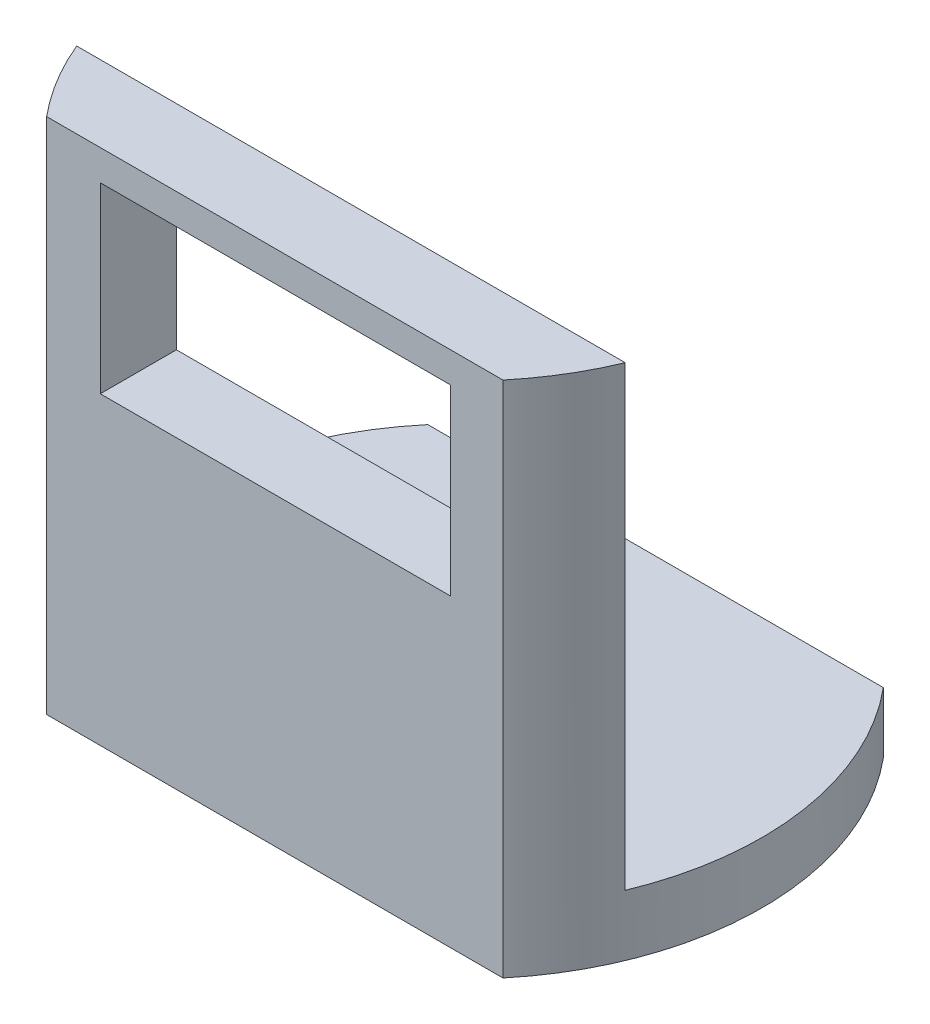
ISO-10303-21;
HEADER;
FILE_DESCRIPTION(('STEP AP214'),'2;1');
FILE_NAME('part.step','',(''),(''),'','','');
FILE_SCHEMA(('AUTOMOTIVE_DESIGN { 1 0 10303 214 1 1 1 1 }'));
ENDSEC;
DATA;
#1=APPLICATION_CONTEXT('core data for automotive mechanical design processes');
#2=APPLICATION_PROTOCOL_DEFINITION('international standard','automotive_design',2000,#1);
#3=PRODUCT_CONTEXT('',#1,'mechanical');
#4=PRODUCT('Part','Part','',(#3));
#5=PRODUCT_RELATED_PRODUCT_CATEGORY('part','',(#4));
#6=PRODUCT_DEFINITION_FORMATION('','',#4);
#7=PRODUCT_DEFINITION_CONTEXT('part definition',#1,'design');
#8=PRODUCT_DEFINITION('design','',#6,#7);
#9=PRODUCT_DEFINITION_SHAPE('','',#8);
#10=(LENGTH_UNIT() NAMED_UNIT(*) SI_UNIT(.MILLI.,.METRE.));
#11=(NAMED_UNIT(*) PLANE_ANGLE_UNIT() SI_UNIT($,.RADIAN.));
#12=(NAMED_UNIT(*) SI_UNIT($,.STERADIAN.) SOLID_ANGLE_UNIT());
#13=UNCERTAINTY_MEASURE_WITH_UNIT(LENGTH_MEASURE(1.E-05),#10,'distance_accuracy_value','');
#14=(GEOMETRIC_REPRESENTATION_CONTEXT(3) GLOBAL_UNCERTAINTY_ASSIGNED_CONTEXT((#13)) GLOBAL_UNIT_ASSIGNED_CONTEXT((#10,
#11,#12)) REPRESENTATION_CONTEXT('',''));
#15=CARTESIAN_POINT('',(0.,0.,0.));
#16=DIRECTION('',(0.,0.,1.));
#17=DIRECTION('',(1.,0.,0.));
#18=AXIS2_PLACEMENT_3D('',#15,#16,#17);
#19=CARTESIAN_POINT('',(-20.,15.,5.));
#20=DIRECTION('',(0.,-1.,0.));
#21=DIRECTION('',(0.,0.,-1.));
#22=AXIS2_PLACEMENT_3D('',#19,#20,#21);
#23=PLANE('',#22);
#24=CARTESIAN_POINT('',(-0.0431315727550396,15.,-7.4856978274626));
#25=DIRECTION('',(0.,-1.,0.));
#26=DIRECTION('',(0.,0.,-1.));
#27=AXIS2_PLACEMENT_3D('',#24,#25,#26);
#28=CIRCLE('',#27,19.5);
#29=CARTESIAN_POINT('',(-18.0490841450552,15.,0.));
#30=VERTEX_POINT('',#29);
#31=CARTESIAN_POINT('',(-15.0216945799762,15.,5.));
#32=VERTEX_POINT('',#31);
#33=EDGE_CURVE('E175',#30,#32,#28,.F.);
#34=ORIENTED_EDGE('',*,*,#33,.T.);
#35=DIRECTION('',(-1.,0.,0.));
#36=VECTOR('',#35,1.);
#37=CARTESIAN_POINT('',(-20.,15.,5.));
#38=LINE('',#37,#36);
#39=CARTESIAN_POINT('',(14.9354314344662,15.,5.));
#40=VERTEX_POINT('',#39);
#41=EDGE_CURVE('E11',#40,#32,#38,.T.);
#42=ORIENTED_EDGE('',*,*,#41,.F.);
#43=CARTESIAN_POINT('',(17.9628209995451,15.,0.));
#44=VERTEX_POINT('',#43);
#45=EDGE_CURVE('E170',#40,#44,#28,.F.);
#46=ORIENTED_EDGE('',*,*,#45,.T.);
#47=DIRECTION('',(-1.,0.,0.));
#48=VECTOR('',#47,1.);
#49=CARTESIAN_POINT('',(-20.,15.,0.));
#50=LINE('',#49,#48);
#51=EDGE_CURVE('E142',#44,#30,#50,.T.);
#52=ORIENTED_EDGE('',*,*,#51,.T.);
#53=EDGE_LOOP('',(#34,#42,#46,#52));
#54=FACE_BOUND('',#53,.T.);
#55=ADVANCED_FACE('F39',(#54),#23,.F.);
#56=CARTESIAN_POINT('',(0.,0.,5.));
#57=DIRECTION('',(0.,0.,1.));
#58=DIRECTION('',(1.,0.,0.));
#59=AXIS2_PLACEMENT_3D('',#56,#57,#58);
#60=PLANE('',#59);
#61=DIRECTION('',(0.,1.,0.));
#62=VECTOR('',#61,1.);
#63=CARTESIAN_POINT('',(-11.5,13.,5.));
#64=LINE('',#63,#62);
#65=CARTESIAN_POINT('',(-11.5,1.,5.));
#66=VERTEX_POINT('',#65);
#67=CARTESIAN_POINT('',(-11.5,13.,5.));
#68=VERTEX_POINT('',#67);
#69=EDGE_CURVE('E189',#66,#68,#64,.T.);
#70=ORIENTED_EDGE('',*,*,#69,.T.);
#71=DIRECTION('',(1.,0.,0.));
#72=VECTOR('',#71,1.);
#73=CARTESIAN_POINT('',(11.5,13.,5.));
#74=LINE('',#73,#72);
#75=CARTESIAN_POINT('',(11.5,13.,5.));
#76=VERTEX_POINT('',#75);
#77=EDGE_CURVE('E193',#68,#76,#74,.T.);
#78=ORIENTED_EDGE('',*,*,#77,.T.);
#79=DIRECTION('',(0.,-1.,0.));
#80=VECTOR('',#79,1.);
#81=CARTESIAN_POINT('',(11.5,13.,5.));
#82=LINE('',#81,#80);
#83=CARTESIAN_POINT('',(11.5,1.,5.));
#84=VERTEX_POINT('',#83);
#85=EDGE_CURVE('E198',#76,#84,#82,.T.);
#86=ORIENTED_EDGE('',*,*,#85,.T.);
#87=DIRECTION('',(-1.,0.,0.));
#88=VECTOR('',#87,1.);
#89=CARTESIAN_POINT('',(11.5,1.,5.));
#90=LINE('',#89,#88);
#91=EDGE_CURVE('E202',#84,#66,#90,.T.);
#92=ORIENTED_EDGE('',*,*,#91,.T.);
#93=EDGE_LOOP('',(#70,#78,#86,#92));
#94=FACE_BOUND('',#93,.T.);
#95=ORIENTED_EDGE('',*,*,#41,.T.);
#96=DIRECTION('',(0.,-1.,0.));
#97=VECTOR('',#96,1.);
#98=CARTESIAN_POINT('',(-15.0216945799762,15.001,5.));
#99=LINE('',#98,#97);
#100=CARTESIAN_POINT('',(-15.0216945799762,-19.,5.));
#101=VERTEX_POINT('',#100);
#102=EDGE_CURVE('E266',#101,#32,#99,.F.);
#103=ORIENTED_EDGE('',*,*,#102,.F.);
#104=DIRECTION('',(-1.,0.,0.));
#105=VECTOR('',#104,1.);
#106=CARTESIAN_POINT('',(-20.,-19.,5.));
#107=LINE('',#106,#105);
#108=CARTESIAN_POINT('',(14.9354314344662,-19.,5.));
#109=VERTEX_POINT('',#108);
#110=EDGE_CURVE('E138',#109,#101,#107,.T.);
#111=ORIENTED_EDGE('',*,*,#110,.F.);
#112=DIRECTION('',(0.,-1.,0.));
#113=VECTOR('',#112,1.);
#114=CARTESIAN_POINT('',(14.9354314344662,15.001,5.));
#115=LINE('',#114,#113);
#116=EDGE_CURVE('E55',#40,#109,#115,.T.);
#117=ORIENTED_EDGE('',*,*,#116,.F.);
#118=EDGE_LOOP('',(#95,#103,#111,#117));
#119=FACE_BOUND('',#118,.T.);
#120=ADVANCED_FACE('F243',(#94,#119),#60,.T.);
#121=CARTESIAN_POINT('',(0.,0.,0.));
#122=DIRECTION('',(0.,0.,1.));
#123=DIRECTION('',(1.,0.,0.));
#124=AXIS2_PLACEMENT_3D('',#121,#122,#123);
#125=PLANE('',#124);
#126=DIRECTION('',(0.,-1.,0.));
#127=VECTOR('',#126,1.);
#128=CARTESIAN_POINT('',(-18.0490841450552,15.001,0.));
#129=LINE('',#128,#127);
#130=CARTESIAN_POINT('',(-18.0490841450552,-15.,0.));
#131=VERTEX_POINT('',#130);
#132=EDGE_CURVE('E167',#131,#30,#129,.F.);
#133=ORIENTED_EDGE('',*,*,#132,.T.);
#134=ORIENTED_EDGE('',*,*,#51,.F.);
#135=DIRECTION('',(0.,-1.,0.));
#136=VECTOR('',#135,1.);
#137=CARTESIAN_POINT('',(17.9628209995451,15.001,0.));
#138=LINE('',#137,#136);
#139=CARTESIAN_POINT('',(17.9628209995451,-15.,0.));
#140=VERTEX_POINT('',#139);
#141=EDGE_CURVE('E168',#44,#140,#138,.T.);
#142=ORIENTED_EDGE('',*,*,#141,.T.);
#143=DIRECTION('',(1.,0.,0.));
#144=VECTOR('',#143,1.);
#145=CARTESIAN_POINT('',(-20.,-15.,0.));
#146=LINE('',#145,#144);
#147=EDGE_CURVE('E42',#131,#140,#146,.T.);
#148=ORIENTED_EDGE('',*,*,#147,.F.);
#149=EDGE_LOOP('',(#133,#134,#142,#148));
#150=FACE_BOUND('',#149,.T.);
#151=DIRECTION('',(1.,0.,0.));
#152=VECTOR('',#151,1.);
#153=CARTESIAN_POINT('',(11.5,13.,0.));
#154=LINE('',#153,#152);
#155=CARTESIAN_POINT('',(-11.5,13.,0.));
#156=VERTEX_POINT('',#155);
#157=CARTESIAN_POINT('',(11.5,13.,0.));
#158=VERTEX_POINT('',#157);
#159=EDGE_CURVE('E208',#156,#158,#154,.T.);
#160=ORIENTED_EDGE('',*,*,#159,.F.);
#161=DIRECTION('',(0.,1.,0.));
#162=VECTOR('',#161,1.);
#163=CARTESIAN_POINT('',(-11.5,13.,0.));
#164=LINE('',#163,#162);
#165=CARTESIAN_POINT('',(-11.5,1.,0.));
#166=VERTEX_POINT('',#165);
#167=EDGE_CURVE('E184',#166,#156,#164,.T.);
#168=ORIENTED_EDGE('',*,*,#167,.F.);
#169=DIRECTION('',(-1.,0.,0.));
#170=VECTOR('',#169,1.);
#171=CARTESIAN_POINT('',(11.5,1.,0.));
#172=LINE('',#171,#170);
#173=CARTESIAN_POINT('',(11.5,1.,0.));
#174=VERTEX_POINT('',#173);
#175=EDGE_CURVE('E194',#174,#166,#172,.T.);
#176=ORIENTED_EDGE('',*,*,#175,.F.);
#177=DIRECTION('',(0.,-1.,0.));
#178=VECTOR('',#177,1.);
#179=CARTESIAN_POINT('',(11.5,13.,0.));
#180=LINE('',#179,#178);
#181=EDGE_CURVE('E212',#158,#174,#180,.T.);
#182=ORIENTED_EDGE('',*,*,#181,.F.);
#183=EDGE_LOOP('',(#160,#168,#176,#182));
#184=FACE_BOUND('',#183,.T.);
#185=ADVANCED_FACE('F165',(#150,#184),#125,.F.);
#186=CARTESIAN_POINT('',(0.,-15.,0.));
#187=DIRECTION('',(0.,-1.,0.));
#188=DIRECTION('',(0.,0.,-1.));
#189=AXIS2_PLACEMENT_3D('',#186,#187,#188);
#190=PLANE('',#189);
#191=CARTESIAN_POINT('',(-0.0431315727550396,-15.,-7.4856978274626));
#192=DIRECTION('',(0.,-1.,0.));
#193=DIRECTION('',(0.,0.,-1.));
#194=AXIS2_PLACEMENT_3D('',#191,#192,#193);
#195=CIRCLE('',#194,19.5);
#196=CARTESIAN_POINT('',(-14.9978044589945,-15.,-20.));
#197=VERTEX_POINT('',#196);
#198=EDGE_CURVE('E161',#197,#131,#195,.F.);
#199=ORIENTED_EDGE('',*,*,#198,.T.);
#200=ORIENTED_EDGE('',*,*,#147,.T.);
#201=CARTESIAN_POINT('',(14.9115413134844,-15.,-20.));
#202=VERTEX_POINT('',#201);
#203=EDGE_CURVE('E124',#140,#202,#195,.F.);
#204=ORIENTED_EDGE('',*,*,#203,.T.);
#205=DIRECTION('',(1.,0.,0.));
#206=VECTOR('',#205,1.);
#207=CARTESIAN_POINT('',(-20.,-15.,-20.));
#208=LINE('',#207,#206);
#209=EDGE_CURVE('E133',#197,#202,#208,.T.);
#210=ORIENTED_EDGE('',*,*,#209,.F.);
#211=EDGE_LOOP('',(#199,#200,#204,#210));
#212=FACE_BOUND('',#211,.T.);
#213=ADVANCED_FACE('F160',(#212),#190,.F.);
#214=CARTESIAN_POINT('',(-20.,-19.,-20.));
#215=DIRECTION('',(0.,0.,1.));
#216=DIRECTION('',(1.,0.,0.));
#217=AXIS2_PLACEMENT_3D('',#214,#215,#216);
#218=PLANE('',#217);
#219=DIRECTION('',(0.,-1.,0.));
#220=VECTOR('',#219,1.);
#221=CARTESIAN_POINT('',(-14.9978044589945,15.001,-20.));
#222=LINE('',#221,#220);
#223=CARTESIAN_POINT('',(-14.9978044589945,-19.,-20.));
#224=VERTEX_POINT('',#223);
#225=EDGE_CURVE('E63',#224,#197,#222,.F.);
#226=ORIENTED_EDGE('',*,*,#225,.T.);
#227=ORIENTED_EDGE('',*,*,#209,.T.);
#228=DIRECTION('',(0.,-1.,0.));
#229=VECTOR('',#228,1.);
#230=CARTESIAN_POINT('',(14.9115413134844,15.001,-20.));
#231=LINE('',#230,#229);
#232=CARTESIAN_POINT('',(14.9115413134844,-19.,-20.));
#233=VERTEX_POINT('',#232);
#234=EDGE_CURVE('E117',#202,#233,#231,.T.);
#235=ORIENTED_EDGE('',*,*,#234,.T.);
#236=DIRECTION('',(1.,0.,0.));
#237=VECTOR('',#236,1.);
#238=CARTESIAN_POINT('',(-20.,-19.,-20.));
#239=LINE('',#238,#237);
#240=EDGE_CURVE('E131',#224,#233,#239,.T.);
#241=ORIENTED_EDGE('',*,*,#240,.F.);
#242=EDGE_LOOP('',(#226,#227,#235,#241));
#243=FACE_BOUND('',#242,.T.);
#244=ADVANCED_FACE('F130',(#243),#218,.F.);
#245=CARTESIAN_POINT('',(0.,-19.,0.));
#246=DIRECTION('',(0.,-1.,0.));
#247=DIRECTION('',(0.,0.,-1.));
#248=AXIS2_PLACEMENT_3D('',#245,#246,#247);
#249=PLANE('',#248);
#250=CARTESIAN_POINT('',(-0.0431315727550396,-19.,-7.4856978274626));
#251=DIRECTION('',(0.,-1.,0.));
#252=DIRECTION('',(0.,0.,-1.));
#253=AXIS2_PLACEMENT_3D('',#250,#251,#252);
#254=CIRCLE('',#253,10.);
#255=CARTESIAN_POINT('',(-0.0431315727550396,-19.,-17.4856978274626));
#256=VERTEX_POINT('',#255);
#257=EDGE_CURVE('E185',#256,#256,#254,.T.);
#258=ORIENTED_EDGE('',*,*,#257,.F.);
#259=EDGE_LOOP('',(#258));
#260=FACE_BOUND('',#259,.T.);
#261=ORIENTED_EDGE('',*,*,#110,.T.);
#262=CARTESIAN_POINT('',(-0.0431315727550396,-19.,-7.4856978274626));
#263=DIRECTION('',(0.,-1.,0.));
#264=DIRECTION('',(0.,0.,-1.));
#265=AXIS2_PLACEMENT_3D('',#262,#263,#264);
#266=CIRCLE('',#265,19.5);
#267=EDGE_CURVE('E125',#101,#224,#266,.T.);
#268=ORIENTED_EDGE('',*,*,#267,.T.);
#269=ORIENTED_EDGE('',*,*,#240,.T.);
#270=EDGE_CURVE('E114',#233,#109,#266,.T.);
#271=ORIENTED_EDGE('',*,*,#270,.T.);
#272=EDGE_LOOP('',(#261,#268,#269,#271));
#273=FACE_BOUND('',#272,.T.);
#274=ADVANCED_FACE('F136',(#260,#273),#249,.T.);
#275=CARTESIAN_POINT('',(-11.5,13.,5.));
#276=DIRECTION('',(-1.,0.,0.));
#277=DIRECTION('',(0.,0.,1.));
#278=AXIS2_PLACEMENT_3D('',#275,#276,#277);
#279=PLANE('',#278);
#280=ORIENTED_EDGE('',*,*,#167,.T.);
#281=DIRECTION('',(0.,0.,-1.));
#282=VECTOR('',#281,1.);
#283=CARTESIAN_POINT('',(-11.5,13.,5.));
#284=LINE('',#283,#282);
#285=EDGE_CURVE('E147',#68,#156,#284,.T.);
#286=ORIENTED_EDGE('',*,*,#285,.F.);
#287=ORIENTED_EDGE('',*,*,#69,.F.);
#288=DIRECTION('',(0.,0.,-1.));
#289=VECTOR('',#288,1.);
#290=CARTESIAN_POINT('',(-11.5,1.,5.));
#291=LINE('',#290,#289);
#292=EDGE_CURVE('E144',#66,#166,#291,.T.);
#293=ORIENTED_EDGE('',*,*,#292,.T.);
#294=EDGE_LOOP('',(#280,#286,#287,#293));
#295=FACE_BOUND('',#294,.T.);
#296=ADVANCED_FACE('F245',(#295),#279,.F.);
#297=CARTESIAN_POINT('',(11.5,1.,5.));
#298=DIRECTION('',(0.,-1.,0.));
#299=DIRECTION('',(0.,0.,-1.));
#300=AXIS2_PLACEMENT_3D('',#297,#298,#299);
#301=PLANE('',#300);
#302=ORIENTED_EDGE('',*,*,#175,.T.);
#303=ORIENTED_EDGE('',*,*,#292,.F.);
#304=ORIENTED_EDGE('',*,*,#91,.F.);
#305=DIRECTION('',(0.,0.,-1.));
#306=VECTOR('',#305,1.);
#307=CARTESIAN_POINT('',(11.5,1.,5.));
#308=LINE('',#307,#306);
#309=EDGE_CURVE('E221',#84,#174,#308,.T.);
#310=ORIENTED_EDGE('',*,*,#309,.T.);
#311=EDGE_LOOP('',(#302,#303,#304,#310));
#312=FACE_BOUND('',#311,.T.);
#313=ADVANCED_FACE('F241',(#312),#301,.F.);
#314=CARTESIAN_POINT('',(11.5,13.,5.));
#315=DIRECTION('',(1.,0.,0.));
#316=DIRECTION('',(0.,1.,0.));
#317=AXIS2_PLACEMENT_3D('',#314,#315,#316);
#318=PLANE('',#317);
#319=ORIENTED_EDGE('',*,*,#181,.T.);
#320=ORIENTED_EDGE('',*,*,#309,.F.);
#321=ORIENTED_EDGE('',*,*,#85,.F.);
#322=DIRECTION('',(0.,0.,-1.));
#323=VECTOR('',#322,1.);
#324=CARTESIAN_POINT('',(11.5,13.,5.));
#325=LINE('',#324,#323);
#326=EDGE_CURVE('E223',#76,#158,#325,.T.);
#327=ORIENTED_EDGE('',*,*,#326,.T.);
#328=EDGE_LOOP('',(#319,#320,#321,#327));
#329=FACE_BOUND('',#328,.T.);
#330=ADVANCED_FACE('F238',(#329),#318,.F.);
#331=CARTESIAN_POINT('',(11.5,13.,5.));
#332=DIRECTION('',(0.,1.,0.));
#333=DIRECTION('',(0.,0.,1.));
#334=AXIS2_PLACEMENT_3D('',#331,#332,#333);
#335=PLANE('',#334);
#336=ORIENTED_EDGE('',*,*,#159,.T.);
#337=ORIENTED_EDGE('',*,*,#326,.F.);
#338=ORIENTED_EDGE('',*,*,#77,.F.);
#339=ORIENTED_EDGE('',*,*,#285,.T.);
#340=EDGE_LOOP('',(#336,#337,#338,#339));
#341=FACE_BOUND('',#340,.T.);
#342=ADVANCED_FACE('F232',(#341),#335,.F.);
#343=CARTESIAN_POINT('',(-0.0431315727550396,-17.,-7.4856978274626));
#344=DIRECTION('',(0.,-1.,0.));
#345=DIRECTION('',(0.,0.,-1.));
#346=AXIS2_PLACEMENT_3D('',#343,#344,#345);
#347=CYLINDRICAL_SURFACE('',#346,10.);
#348=CARTESIAN_POINT('',(-0.0431315727550396,-17.,-7.4856978274626));
#349=DIRECTION('',(0.,-1.,0.));
#350=DIRECTION('',(0.,0.,-1.));
#351=AXIS2_PLACEMENT_3D('',#348,#349,#350);
#352=CIRCLE('',#351,10.);
#353=CARTESIAN_POINT('',(-0.0431315727550396,-17.,-17.4856978274626));
#354=VERTEX_POINT('',#353);
#355=EDGE_CURVE('E180',#354,#354,#352,.T.);
#356=ORIENTED_EDGE('',*,*,#355,.F.);
#357=EDGE_LOOP('',(#356));
#358=FACE_BOUND('',#357,.T.);
#359=ORIENTED_EDGE('',*,*,#257,.T.);
#360=EDGE_LOOP('',(#359));
#361=FACE_BOUND('',#360,.T.);
#362=ADVANCED_FACE('F284',(#358,#361),#347,.F.);
#363=CARTESIAN_POINT('',(-0.0431315727550396,-17.,-7.4856978274626));
#364=DIRECTION('',(0.,-1.,0.));
#365=DIRECTION('',(0.,0.,-1.));
#366=AXIS2_PLACEMENT_3D('',#363,#364,#365);
#367=PLANE('',#366);
#368=ORIENTED_EDGE('',*,*,#355,.T.);
#369=EDGE_LOOP('',(#368));
#370=FACE_BOUND('',#369,.T.);
#371=ADVANCED_FACE('F280',(#370),#367,.T.);
#372=CARTESIAN_POINT('',(-0.0431315727550396,15.001,-7.4856978274626));
#373=DIRECTION('',(0.,-1.,0.));
#374=DIRECTION('',(0.,0.,-1.));
#375=AXIS2_PLACEMENT_3D('',#372,#373,#374);
#376=CYLINDRICAL_SURFACE('',#375,19.5);
#377=ORIENTED_EDGE('',*,*,#45,.F.);
#378=ORIENTED_EDGE('',*,*,#116,.T.);
#379=ORIENTED_EDGE('',*,*,#270,.F.);
#380=ORIENTED_EDGE('',*,*,#234,.F.);
#381=ORIENTED_EDGE('',*,*,#203,.F.);
#382=ORIENTED_EDGE('',*,*,#141,.F.);
#383=EDGE_LOOP('',(#377,#378,#379,#380,#381,#382));
#384=FACE_BOUND('',#383,.T.);
#385=ADVANCED_FACE('F116',(#384),#376,.T.);
#386=ORIENTED_EDGE('',*,*,#267,.F.);
#387=ORIENTED_EDGE('',*,*,#102,.T.);
#388=ORIENTED_EDGE('',*,*,#33,.F.);
#389=ORIENTED_EDGE('',*,*,#132,.F.);
#390=ORIENTED_EDGE('',*,*,#198,.F.);
#391=ORIENTED_EDGE('',*,*,#225,.F.);
#392=EDGE_LOOP('',(#386,#387,#388,#389,#390,#391));
#393=FACE_BOUND('',#392,.T.);
#394=ADVANCED_FACE('F274',(#393),#376,.T.);
#395=CLOSED_SHELL('',(#55,#120,#185,#213,#244,#274,#296,#313,#330,#342,#362,#371,#385,#394));
#396=MANIFOLD_SOLID_BREP('B2',#395);
#397=ADVANCED_BREP_SHAPE_REPRESENTATION('',(#18,#396),#14);
#398=SHAPE_DEFINITION_REPRESENTATION(#9,#397);
ENDSEC;
END-ISO-10303-21;
